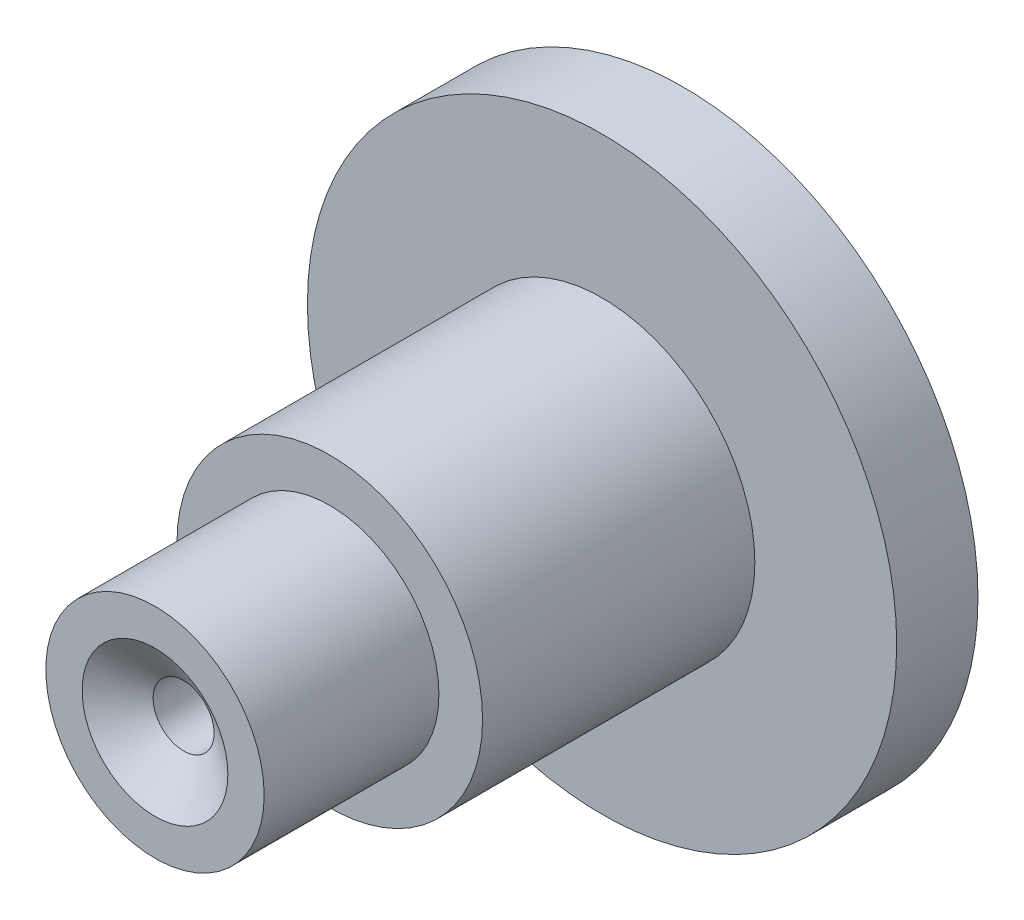
ISO-10303-21;
HEADER;
FILE_DESCRIPTION(('STEP AP214'),'2;1');
FILE_NAME('part.step','',(''),(''),'','','');
FILE_SCHEMA(('AUTOMOTIVE_DESIGN { 1 0 10303 214 1 1 1 1 }'));
ENDSEC;
DATA;
#1=APPLICATION_CONTEXT('core data for automotive mechanical design processes');
#2=APPLICATION_PROTOCOL_DEFINITION('international standard','automotive_design',2000,#1);
#3=PRODUCT_CONTEXT('',#1,'mechanical');
#4=PRODUCT('Part','Part','',(#3));
#5=PRODUCT_RELATED_PRODUCT_CATEGORY('part','',(#4));
#6=PRODUCT_DEFINITION_FORMATION('','',#4);
#7=PRODUCT_DEFINITION_CONTEXT('part definition',#1,'design');
#8=PRODUCT_DEFINITION('design','',#6,#7);
#9=PRODUCT_DEFINITION_SHAPE('','',#8);
#10=(LENGTH_UNIT() NAMED_UNIT(*) SI_UNIT(.MILLI.,.METRE.));
#11=(NAMED_UNIT(*) PLANE_ANGLE_UNIT() SI_UNIT($,.RADIAN.));
#12=(NAMED_UNIT(*) SI_UNIT($,.STERADIAN.) SOLID_ANGLE_UNIT());
#13=UNCERTAINTY_MEASURE_WITH_UNIT(LENGTH_MEASURE(1.E-05),#10,'distance_accuracy_value','');
#14=(GEOMETRIC_REPRESENTATION_CONTEXT(3) GLOBAL_UNCERTAINTY_ASSIGNED_CONTEXT((#13)) GLOBAL_UNIT_ASSIGNED_CONTEXT((#10,
#11,#12)) REPRESENTATION_CONTEXT('',''));
#15=CARTESIAN_POINT('',(0.,0.,0.));
#16=DIRECTION('',(0.,0.,1.));
#17=DIRECTION('',(1.,0.,0.));
#18=AXIS2_PLACEMENT_3D('',#15,#16,#17);
#19=CARTESIAN_POINT('',(0.,0.,0.));
#20=DIRECTION('',(0.,0.,1.));
#21=DIRECTION('',(1.,0.,0.));
#22=AXIS2_PLACEMENT_3D('',#19,#20,#21);
#23=PLANE('',#22);
#24=CARTESIAN_POINT('',(0.,0.,0.));
#25=DIRECTION('',(0.,0.,1.));
#26=DIRECTION('',(1.,0.,0.));
#27=AXIS2_PLACEMENT_3D('',#24,#25,#26);
#28=CIRCLE('',#27,46.0375);
#29=CARTESIAN_POINT('',(46.0375,0.,0.));
#30=VERTEX_POINT('',#29);
#31=EDGE_CURVE('E10',#30,#30,#28,.T.);
#32=ORIENTED_EDGE('',*,*,#31,.F.);
#33=EDGE_LOOP('',(#32));
#34=FACE_BOUND('',#33,.T.);
#35=ADVANCED_FACE('F32',(#34),#23,.F.);
#36=CARTESIAN_POINT('',(0.,0.,57.15));
#37=DIRECTION('',(0.,0.,1.));
#38=DIRECTION('',(1.,0.,0.));
#39=AXIS2_PLACEMENT_3D('',#36,#37,#38);
#40=CYLINDRICAL_SURFACE('',#39,46.0375);
#41=CARTESIAN_POINT('',(0.,0.,12.7));
#42=DIRECTION('',(0.,0.,1.));
#43=DIRECTION('',(1.,0.,0.));
#44=AXIS2_PLACEMENT_3D('',#41,#42,#43);
#45=CIRCLE('',#44,46.0375);
#46=CARTESIAN_POINT('',(46.0375,0.,12.7));
#47=VERTEX_POINT('',#46);
#48=EDGE_CURVE('E38',#47,#47,#45,.T.);
#49=ORIENTED_EDGE('',*,*,#48,.F.);
#50=EDGE_LOOP('',(#49));
#51=FACE_BOUND('',#50,.T.);
#52=ORIENTED_EDGE('',*,*,#31,.T.);
#53=EDGE_LOOP('',(#52));
#54=FACE_BOUND('',#53,.T.);
#55=ADVANCED_FACE('F107',(#51,#54),#40,.T.);
#56=CARTESIAN_POINT('',(0.,46.0375,12.7));
#57=DIRECTION('',(0.,0.,-1.));
#58=DIRECTION('',(-1.,0.,0.));
#59=AXIS2_PLACEMENT_3D('',#56,#57,#58);
#60=PLANE('',#59);
#61=CARTESIAN_POINT('',(0.,0.,12.7));
#62=DIRECTION('',(0.,0.,1.));
#63=DIRECTION('',(1.,0.,0.));
#64=AXIS2_PLACEMENT_3D('',#61,#62,#63);
#65=CIRCLE('',#64,23.876);
#66=CARTESIAN_POINT('',(23.876,0.,12.7));
#67=VERTEX_POINT('',#66);
#68=EDGE_CURVE('E42',#67,#67,#65,.T.);
#69=ORIENTED_EDGE('',*,*,#68,.F.);
#70=EDGE_LOOP('',(#69));
#71=FACE_BOUND('',#70,.T.);
#72=ORIENTED_EDGE('',*,*,#48,.T.);
#73=EDGE_LOOP('',(#72));
#74=FACE_BOUND('',#73,.T.);
#75=ADVANCED_FACE('F102',(#71,#74),#60,.F.);
#76=CARTESIAN_POINT('',(0.,0.,57.15));
#77=DIRECTION('',(0.,0.,1.));
#78=DIRECTION('',(1.,0.,0.));
#79=AXIS2_PLACEMENT_3D('',#76,#77,#78);
#80=CYLINDRICAL_SURFACE('',#79,23.876);
#81=CARTESIAN_POINT('',(0.,0.,55.245));
#82=DIRECTION('',(0.,0.,1.));
#83=DIRECTION('',(1.,0.,0.));
#84=AXIS2_PLACEMENT_3D('',#81,#82,#83);
#85=CIRCLE('',#84,23.876);
#86=CARTESIAN_POINT('',(23.876,0.,55.245));
#87=VERTEX_POINT('',#86);
#88=EDGE_CURVE('E46',#87,#87,#85,.T.);
#89=ORIENTED_EDGE('',*,*,#88,.F.);
#90=EDGE_LOOP('',(#89));
#91=FACE_BOUND('',#90,.T.);
#92=ORIENTED_EDGE('',*,*,#68,.T.);
#93=EDGE_LOOP('',(#92));
#94=FACE_BOUND('',#93,.T.);
#95=ADVANCED_FACE('F96',(#91,#94),#80,.T.);
#96=CARTESIAN_POINT('',(0.,23.876,55.245));
#97=DIRECTION('',(0.,0.,-1.));
#98=DIRECTION('',(-1.,0.,0.));
#99=AXIS2_PLACEMENT_3D('',#96,#97,#98);
#100=PLANE('',#99);
#101=CARTESIAN_POINT('',(0.,0.,55.245));
#102=DIRECTION('',(0.,0.,1.));
#103=DIRECTION('',(1.,0.,0.));
#104=AXIS2_PLACEMENT_3D('',#101,#102,#103);
#105=CIRCLE('',#104,17.0595499569898);
#106=CARTESIAN_POINT('',(17.0595499569898,0.,55.245));
#107=VERTEX_POINT('',#106);
#108=EDGE_CURVE('E51',#107,#107,#105,.T.);
#109=ORIENTED_EDGE('',*,*,#108,.F.);
#110=EDGE_LOOP('',(#109));
#111=FACE_BOUND('',#110,.T.);
#112=ORIENTED_EDGE('',*,*,#88,.T.);
#113=EDGE_LOOP('',(#112));
#114=FACE_BOUND('',#113,.T.);
#115=ADVANCED_FACE('F90',(#111,#114),#100,.F.);
#116=CARTESIAN_POINT('',(0.,0.,57.15));
#117=DIRECTION('',(0.,0.,1.));
#118=DIRECTION('',(1.,0.,0.));
#119=AXIS2_PLACEMENT_3D('',#116,#117,#118);
#120=CYLINDRICAL_SURFACE('',#119,17.0595499569898);
#121=CARTESIAN_POINT('',(0.,0.,82.55));
#122=DIRECTION('',(0.,0.,1.));
#123=DIRECTION('',(1.,0.,0.));
#124=AXIS2_PLACEMENT_3D('',#121,#122,#123);
#125=CIRCLE('',#124,17.0595499569898);
#126=CARTESIAN_POINT('',(17.0595499569898,0.,82.55));
#127=VERTEX_POINT('',#126);
#128=EDGE_CURVE('E54',#127,#127,#125,.T.);
#129=ORIENTED_EDGE('',*,*,#128,.F.);
#130=EDGE_LOOP('',(#129));
#131=FACE_BOUND('',#130,.T.);
#132=ORIENTED_EDGE('',*,*,#108,.T.);
#133=EDGE_LOOP('',(#132));
#134=FACE_BOUND('',#133,.T.);
#135=ADVANCED_FACE('F84',(#131,#134),#120,.T.);
#136=CARTESIAN_POINT('',(0.,17.0595499569898,82.55));
#137=DIRECTION('',(0.,0.,-1.));
#138=DIRECTION('',(-1.,0.,0.));
#139=AXIS2_PLACEMENT_3D('',#136,#137,#138);
#140=PLANE('',#139);
#141=CARTESIAN_POINT('',(0.,0.,82.55));
#142=DIRECTION('',(0.,0.,1.));
#143=DIRECTION('',(1.,0.,0.));
#144=AXIS2_PLACEMENT_3D('',#141,#142,#143);
#145=CIRCLE('',#144,11.385820752823);
#146=CARTESIAN_POINT('',(11.385820752823,0.,82.55));
#147=VERTEX_POINT('',#146);
#148=EDGE_CURVE('E57',#147,#147,#145,.T.);
#149=ORIENTED_EDGE('',*,*,#148,.F.);
#150=EDGE_LOOP('',(#149));
#151=FACE_BOUND('',#150,.T.);
#152=ORIENTED_EDGE('',*,*,#128,.T.);
#153=EDGE_LOOP('',(#152));
#154=FACE_BOUND('',#153,.T.);
#155=ADVANCED_FACE('F78',(#151,#154),#140,.F.);
#156=CARTESIAN_POINT('',(0.,0.,82.55));
#157=DIRECTION('',(0.,0.,1.));
#158=DIRECTION('',(1.,0.,0.));
#159=AXIS2_PLACEMENT_3D('',#156,#157,#158);
#160=CONICAL_SURFACE('',#159,11.385820752823,0.976880170026561);
#161=CARTESIAN_POINT('',(0.,0.,78.0776531689114));
#162=DIRECTION('',(0.,0.,1.));
#163=DIRECTION('',(1.,0.,0.));
#164=AXIS2_PLACEMENT_3D('',#161,#162,#163);
#165=CIRCLE('',#164,4.7625);
#166=CARTESIAN_POINT('',(4.7625,0.,78.0776531689114));
#167=VERTEX_POINT('',#166);
#168=EDGE_CURVE('E60',#167,#167,#165,.T.);
#169=ORIENTED_EDGE('',*,*,#168,.F.);
#170=EDGE_LOOP('',(#169));
#171=FACE_BOUND('',#170,.T.);
#172=ORIENTED_EDGE('',*,*,#148,.T.);
#173=EDGE_LOOP('',(#172));
#174=FACE_BOUND('',#173,.T.);
#175=ADVANCED_FACE('F72',(#171,#174),#160,.F.);
#176=CARTESIAN_POINT('',(0.,0.,57.15));
#177=DIRECTION('',(0.,0.,1.));
#178=DIRECTION('',(1.,0.,0.));
#179=AXIS2_PLACEMENT_3D('',#176,#177,#178);
#180=CYLINDRICAL_SURFACE('',#179,4.7625);
#181=CARTESIAN_POINT('',(0.,0.,57.15));
#182=DIRECTION('',(0.,0.,1.));
#183=DIRECTION('',(1.,0.,0.));
#184=AXIS2_PLACEMENT_3D('',#181,#182,#183);
#185=CIRCLE('',#184,4.7625);
#186=CARTESIAN_POINT('',(4.7625,0.,57.15));
#187=VERTEX_POINT('',#186);
#188=EDGE_CURVE('E63',#187,#187,#185,.T.);
#189=ORIENTED_EDGE('',*,*,#188,.F.);
#190=EDGE_LOOP('',(#189));
#191=FACE_BOUND('',#190,.T.);
#192=ORIENTED_EDGE('',*,*,#168,.T.);
#193=EDGE_LOOP('',(#192));
#194=FACE_BOUND('',#193,.T.);
#195=ADVANCED_FACE('F69',(#191,#194),#180,.F.);
#196=CARTESIAN_POINT('',(0.,4.7625,57.15));
#197=DIRECTION('',(0.,0.,-1.));
#198=DIRECTION('',(-1.,0.,0.));
#199=AXIS2_PLACEMENT_3D('',#196,#197,#198);
#200=PLANE('',#199);
#201=ORIENTED_EDGE('',*,*,#188,.T.);
#202=EDGE_LOOP('',(#201));
#203=FACE_BOUND('',#202,.T.);
#204=ADVANCED_FACE('F67',(#203),#200,.F.);
#205=CLOSED_SHELL('',(#35,#55,#75,#95,#115,#135,#155,#175,#195,#204));
#206=MANIFOLD_SOLID_BREP('B2',#205);
#207=ADVANCED_BREP_SHAPE_REPRESENTATION('',(#18,#206),#14);
#208=SHAPE_DEFINITION_REPRESENTATION(#9,#207);
ENDSEC;
END-ISO-10303-21;
